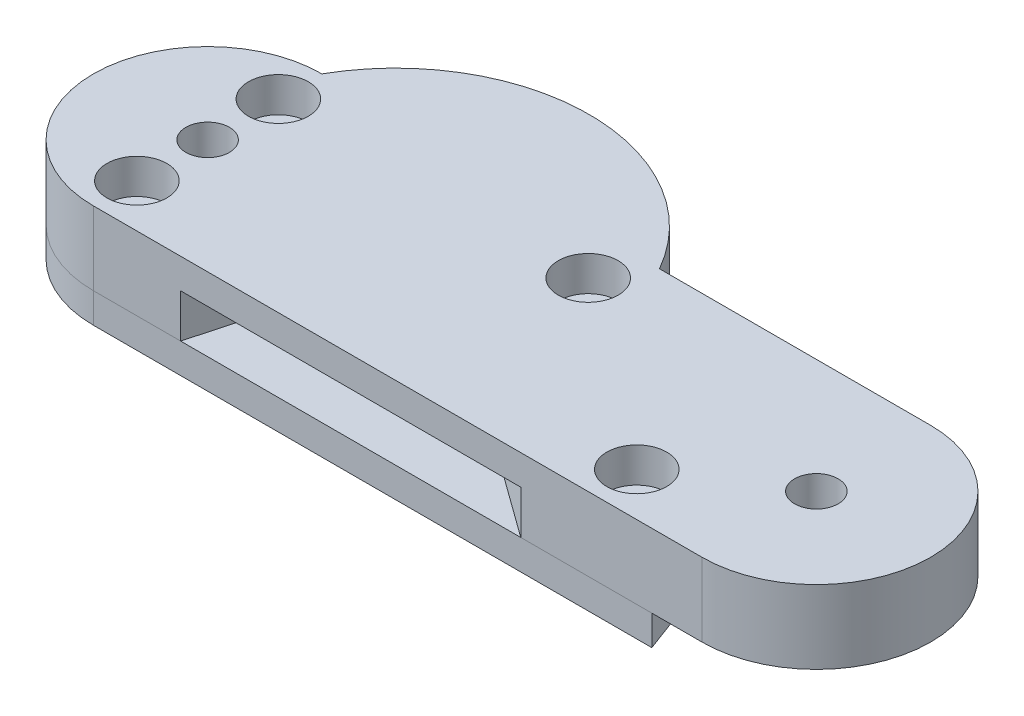
ISO-10303-21;
HEADER;
FILE_DESCRIPTION(('STEP AP214'),'2;1');
FILE_NAME('part.step','',(''),(''),'','','');
FILE_SCHEMA(('AUTOMOTIVE_DESIGN { 1 0 10303 214 1 1 1 1 }'));
ENDSEC;
DATA;
#1=APPLICATION_CONTEXT('core data for automotive mechanical design processes');
#2=APPLICATION_PROTOCOL_DEFINITION('international standard','automotive_design',2000,#1);
#3=PRODUCT_CONTEXT('',#1,'mechanical');
#4=PRODUCT('Part','Part','',(#3));
#5=PRODUCT_RELATED_PRODUCT_CATEGORY('part','',(#4));
#6=PRODUCT_DEFINITION_FORMATION('','',#4);
#7=PRODUCT_DEFINITION_CONTEXT('part definition',#1,'design');
#8=PRODUCT_DEFINITION('design','',#6,#7);
#9=PRODUCT_DEFINITION_SHAPE('','',#8);
#10=(LENGTH_UNIT() NAMED_UNIT(*) SI_UNIT(.MILLI.,.METRE.));
#11=(NAMED_UNIT(*) PLANE_ANGLE_UNIT() SI_UNIT($,.RADIAN.));
#12=(NAMED_UNIT(*) SI_UNIT($,.STERADIAN.) SOLID_ANGLE_UNIT());
#13=UNCERTAINTY_MEASURE_WITH_UNIT(LENGTH_MEASURE(1.E-05),#10,'distance_accuracy_value','');
#14=(GEOMETRIC_REPRESENTATION_CONTEXT(3) GLOBAL_UNCERTAINTY_ASSIGNED_CONTEXT((#13)) GLOBAL_UNIT_ASSIGNED_CONTEXT((#10,
#11,#12)) REPRESENTATION_CONTEXT('',''));
#15=CARTESIAN_POINT('',(0.,0.,0.));
#16=DIRECTION('',(0.,0.,1.));
#17=DIRECTION('',(1.,0.,0.));
#18=AXIS2_PLACEMENT_3D('',#15,#16,#17);
#19=CARTESIAN_POINT('',(0.,2.,0.));
#20=DIRECTION('',(0.,1.,0.));
#21=DIRECTION('',(0.,0.,-1.));
#22=AXIS2_PLACEMENT_3D('',#19,#20,#21);
#23=PLANE('',#22);
#24=CARTESIAN_POINT('',(-40.4241193156667,2.,-1.7460511013579));
#25=DIRECTION('',(0.,1.,0.));
#26=DIRECTION('',(0.,0.,1.));
#27=AXIS2_PLACEMENT_3D('',#24,#25,#26);
#28=CIRCLE('',#27,17.8069548217708);
#29=CARTESIAN_POINT('',(-24.917700351162,2.,-10.5003992165423));
#30=VERTEX_POINT('',#29);
#31=CARTESIAN_POINT('',(-55.9305382801715,2.,-10.5003992165423));
#32=VERTEX_POINT('',#31);
#33=EDGE_CURVE('E123',#30,#32,#28,.T.);
#34=ORIENTED_EDGE('',*,*,#33,.T.);
#35=CARTESIAN_POINT('',(-55.9305382801715,2.,0.));
#36=DIRECTION('',(0.,-1.,0.));
#37=DIRECTION('',(0.,0.,-1.));
#38=AXIS2_PLACEMENT_3D('',#35,#36,#37);
#39=CIRCLE('',#38,10.5003992165423);
#40=CARTESIAN_POINT('',(-55.9305382801715,2.,10.5003992165423));
#41=VERTEX_POINT('',#40);
#42=EDGE_CURVE('E103',#41,#32,#39,.T.);
#43=ORIENTED_EDGE('',*,*,#42,.F.);
#44=DIRECTION('',(1.,0.,0.));
#45=VECTOR('',#44,1.);
#46=CARTESIAN_POINT('',(0.,2.,10.5003992165423));
#47=LINE('',#46,#45);
#48=CARTESIAN_POINT('',(-4.6195471407067,2.,10.5003992165423));
#49=VERTEX_POINT('',#48);
#50=EDGE_CURVE('E112',#41,#49,#47,.T.);
#51=ORIENTED_EDGE('',*,*,#50,.T.);
#52=DIRECTION('',(-0.349715205744596,0.,-0.93685605877905));
#53=VECTOR('',#52,1.);
#54=CARTESIAN_POINT('',(-12.458850175581,2.,-10.5003992165423));
#55=LINE('',#54,#53);
#56=CARTESIAN_POINT('',(-12.458850175581,2.,-10.5003992165423));
#57=VERTEX_POINT('',#56);
#58=EDGE_CURVE('E154',#49,#57,#55,.T.);
#59=ORIENTED_EDGE('',*,*,#58,.T.);
#60=DIRECTION('',(1.,0.,0.));
#61=VECTOR('',#60,1.);
#62=CARTESIAN_POINT('',(0.,2.,-10.5003992165423));
#63=LINE('',#62,#61);
#64=EDGE_CURVE('E124',#30,#57,#63,.T.);
#65=ORIENTED_EDGE('',*,*,#64,.F.);
#66=EDGE_LOOP('',(#34,#43,#51,#59,#65));
#67=FACE_BOUND('',#66,.T.);
#68=CARTESIAN_POINT('',(-55.9305382801715,2.,6.5003992165423));
#69=DIRECTION('',(0.,-1.,0.));
#70=DIRECTION('',(0.,0.,-1.));
#71=AXIS2_PLACEMENT_3D('',#68,#69,#70);
#72=CIRCLE('',#71,1.5);
#73=CARTESIAN_POINT('',(-55.9305382801715,2.,5.0003992165423));
#74=VERTEX_POINT('',#73);
#75=EDGE_CURVE('E171',#74,#74,#72,.F.);
#76=ORIENTED_EDGE('',*,*,#75,.F.);
#77=EDGE_LOOP('',(#76));
#78=FACE_BOUND('',#77,.T.);
#79=CARTESIAN_POINT('',(-55.9305382801715,2.,0.));
#80=DIRECTION('',(0.,-1.,0.));
#81=DIRECTION('',(0.,0.,-1.));
#82=AXIS2_PLACEMENT_3D('',#79,#80,#81);
#83=CIRCLE('',#82,2.);
#84=CARTESIAN_POINT('',(-55.9305382801715,2.,-2.));
#85=VERTEX_POINT('',#84);
#86=EDGE_CURVE('E118',#85,#85,#83,.T.);
#87=ORIENTED_EDGE('',*,*,#86,.T.);
#88=EDGE_LOOP('',(#87));
#89=FACE_BOUND('',#88,.T.);
#90=CARTESIAN_POINT('',(-55.9305382801715,2.,-6.5003992165423));
#91=DIRECTION('',(0.,-1.,0.));
#92=DIRECTION('',(0.,0.,-1.));
#93=AXIS2_PLACEMENT_3D('',#90,#91,#92);
#94=CIRCLE('',#93,1.5);
#95=CARTESIAN_POINT('',(-55.9305382801715,2.,-8.00039921654231));
#96=VERTEX_POINT('',#95);
#97=EDGE_CURVE('E126',#96,#96,#94,.F.);
#98=ORIENTED_EDGE('',*,*,#97,.F.);
#99=EDGE_LOOP('',(#98));
#100=FACE_BOUND('',#99,.T.);
#101=CARTESIAN_POINT('',(-27.4615510728353,2.,-6.5003992165423));
#102=DIRECTION('',(0.,-1.,0.));
#103=DIRECTION('',(0.,0.,-1.));
#104=AXIS2_PLACEMENT_3D('',#101,#102,#103);
#105=CIRCLE('',#104,1.5);
#106=CARTESIAN_POINT('',(-27.4615510728353,2.,-8.00039921654231));
#107=VERTEX_POINT('',#106);
#108=EDGE_CURVE('E165',#107,#107,#105,.F.);
#109=ORIENTED_EDGE('',*,*,#108,.F.);
#110=EDGE_LOOP('',(#109));
#111=FACE_BOUND('',#110,.T.);
#112=CARTESIAN_POINT('',(-10.,2.,6.5003992165423));
#113=DIRECTION('',(0.,-1.,0.));
#114=DIRECTION('',(0.,0.,-1.));
#115=AXIS2_PLACEMENT_3D('',#112,#113,#114);
#116=CIRCLE('',#115,1.5);
#117=CARTESIAN_POINT('',(-10.,2.,5.0003992165423));
#118=VERTEX_POINT('',#117);
#119=EDGE_CURVE('E168',#118,#118,#116,.F.);
#120=ORIENTED_EDGE('',*,*,#119,.F.);
#121=EDGE_LOOP('',(#120));
#122=FACE_BOUND('',#121,.T.);
#123=ADVANCED_FACE('F51',(#67,#78,#89,#100,#111,#122),#23,.T.);
#124=CARTESIAN_POINT('',(0.,-0.75,10.5003992165423));
#125=DIRECTION('',(0.,0.,-1.));
#126=DIRECTION('',(-1.,0.,0.));
#127=AXIS2_PLACEMENT_3D('',#124,#125,#126);
#128=PLANE('',#127);
#129=ORIENTED_EDGE('',*,*,#50,.F.);
#130=DIRECTION('',(0.,1.,0.));
#131=VECTOR('',#130,1.);
#132=CARTESIAN_POINT('',(-55.9305382801715,-0.75,10.5003992165423));
#133=LINE('',#132,#131);
#134=CARTESIAN_POINT('',(-55.9305382801715,-0.75,10.5003992165423));
#135=VERTEX_POINT('',#134);
#136=EDGE_CURVE('E99',#135,#41,#133,.T.);
#137=ORIENTED_EDGE('',*,*,#136,.F.);
#138=DIRECTION('',(1.,0.,0.));
#139=VECTOR('',#138,1.);
#140=CARTESIAN_POINT('',(0.,-0.75,10.5003992165423));
#141=LINE('',#140,#139);
#142=CARTESIAN_POINT('',(-4.6195471407067,-0.75,10.5003992165423));
#143=VERTEX_POINT('',#142);
#144=EDGE_CURVE('E109',#135,#143,#141,.T.);
#145=ORIENTED_EDGE('',*,*,#144,.T.);
#146=DIRECTION('',(0.,-1.,0.));
#147=VECTOR('',#146,1.);
#148=CARTESIAN_POINT('',(-4.6195471407067,33.1152802892206,10.5003992165423));
#149=LINE('',#148,#147);
#150=EDGE_CURVE('E114',#49,#143,#149,.T.);
#151=ORIENTED_EDGE('',*,*,#150,.F.);
#152=EDGE_LOOP('',(#129,#137,#145,#151));
#153=FACE_BOUND('',#152,.T.);
#154=ADVANCED_FACE('F113',(#153),#128,.F.);
#155=CARTESIAN_POINT('',(0.,-0.75,0.));
#156=DIRECTION('',(0.,-1.,0.));
#157=DIRECTION('',(0.,0.,1.));
#158=AXIS2_PLACEMENT_3D('',#155,#156,#157);
#159=PLANE('',#158);
#160=DIRECTION('',(0.349715205744595,0.,0.93685605877905));
#161=VECTOR('',#160,1.);
#162=CARTESIAN_POINT('',(-12.458850175581,-0.75,-10.5003992165423));
#163=LINE('',#162,#161);
#164=CARTESIAN_POINT('',(-12.458850175581,-0.75,-10.5003992165423));
#165=VERTEX_POINT('',#164);
#166=EDGE_CURVE('E12',#165,#143,#163,.T.);
#167=ORIENTED_EDGE('',*,*,#166,.T.);
#168=ORIENTED_EDGE('',*,*,#144,.F.);
#169=CARTESIAN_POINT('',(-55.9305382801715,-0.75,0.));
#170=DIRECTION('',(0.,1.,0.));
#171=DIRECTION('',(0.,0.,1.));
#172=AXIS2_PLACEMENT_3D('',#169,#170,#171);
#173=CIRCLE('',#172,10.5003992165423);
#174=CARTESIAN_POINT('',(-55.9305382801715,-0.749999999999997,-10.5003992165423));
#175=VERTEX_POINT('',#174);
#176=EDGE_CURVE('E106',#175,#135,#173,.T.);
#177=ORIENTED_EDGE('',*,*,#176,.F.);
#178=CARTESIAN_POINT('',(-40.4241193156667,-0.749999999999997,-1.7460511013579));
#179=DIRECTION('',(0.,1.,0.));
#180=DIRECTION('',(0.,0.,1.));
#181=AXIS2_PLACEMENT_3D('',#178,#179,#180);
#182=CIRCLE('',#181,17.8069548217708);
#183=CARTESIAN_POINT('',(-24.917700351162,-0.749999999999997,-10.5003992165423));
#184=VERTEX_POINT('',#183);
#185=EDGE_CURVE('E134',#184,#175,#182,.T.);
#186=ORIENTED_EDGE('',*,*,#185,.F.);
#187=DIRECTION('',(-1.,0.,0.));
#188=VECTOR('',#187,1.);
#189=CARTESIAN_POINT('',(0.,-0.75,-10.5003992165423));
#190=LINE('',#189,#188);
#191=EDGE_CURVE('E139',#165,#184,#190,.T.);
#192=ORIENTED_EDGE('',*,*,#191,.F.);
#193=EDGE_LOOP('',(#167,#168,#177,#186,#192));
#194=FACE_BOUND('',#193,.T.);
#195=CARTESIAN_POINT('',(-55.9305382801715,-0.75,-6.5003992165423));
#196=DIRECTION('',(0.,-1.,0.));
#197=DIRECTION('',(0.,0.,-1.));
#198=AXIS2_PLACEMENT_3D('',#195,#196,#197);
#199=CIRCLE('',#198,1.5);
#200=CARTESIAN_POINT('',(-55.9305382801715,-0.75,-8.00039921654231));
#201=VERTEX_POINT('',#200);
#202=EDGE_CURVE('E151',#201,#201,#199,.T.);
#203=ORIENTED_EDGE('',*,*,#202,.F.);
#204=EDGE_LOOP('',(#203));
#205=FACE_BOUND('',#204,.T.);
#206=CARTESIAN_POINT('',(-55.9305382801715,-0.75,6.5003992165423));
#207=DIRECTION('',(0.,-1.,0.));
#208=DIRECTION('',(0.,0.,-1.));
#209=AXIS2_PLACEMENT_3D('',#206,#207,#208);
#210=CIRCLE('',#209,1.5);
#211=CARTESIAN_POINT('',(-55.9305382801715,-0.75,5.0003992165423));
#212=VERTEX_POINT('',#211);
#213=EDGE_CURVE('E155',#212,#212,#210,.T.);
#214=ORIENTED_EDGE('',*,*,#213,.F.);
#215=EDGE_LOOP('',(#214));
#216=FACE_BOUND('',#215,.T.);
#217=CARTESIAN_POINT('',(-10.,-0.75,6.5003992165423));
#218=DIRECTION('',(0.,-1.,0.));
#219=DIRECTION('',(0.,0.,-1.));
#220=AXIS2_PLACEMENT_3D('',#217,#218,#219);
#221=CIRCLE('',#220,1.5);
#222=CARTESIAN_POINT('',(-10.,-0.75,5.0003992165423));
#223=VERTEX_POINT('',#222);
#224=EDGE_CURVE('E150',#223,#223,#221,.T.);
#225=ORIENTED_EDGE('',*,*,#224,.F.);
#226=EDGE_LOOP('',(#225));
#227=FACE_BOUND('',#226,.T.);
#228=CARTESIAN_POINT('',(-27.4615510728353,-0.75,-6.5003992165423));
#229=DIRECTION('',(0.,-1.,0.));
#230=DIRECTION('',(0.,0.,-1.));
#231=AXIS2_PLACEMENT_3D('',#228,#229,#230);
#232=CIRCLE('',#231,1.5);
#233=CARTESIAN_POINT('',(-27.4615510728353,-0.75,-8.00039921654231));
#234=VERTEX_POINT('',#233);
#235=EDGE_CURVE('E147',#234,#234,#232,.T.);
#236=ORIENTED_EDGE('',*,*,#235,.F.);
#237=EDGE_LOOP('',(#236));
#238=FACE_BOUND('',#237,.T.);
#239=CARTESIAN_POINT('',(-55.9305382801715,-0.75,0.));
#240=DIRECTION('',(0.,1.,0.));
#241=DIRECTION('',(0.,0.,1.));
#242=AXIS2_PLACEMENT_3D('',#239,#240,#241);
#243=CIRCLE('',#242,2.);
#244=CARTESIAN_POINT('',(-55.9305382801715,-0.75,2.));
#245=VERTEX_POINT('',#244);
#246=EDGE_CURVE('E135',#245,#245,#243,.T.);
#247=ORIENTED_EDGE('',*,*,#246,.T.);
#248=EDGE_LOOP('',(#247));
#249=FACE_BOUND('',#248,.T.);
#250=ADVANCED_FACE('F137',(#194,#205,#216,#227,#238,#249),#159,.T.);
#251=CARTESIAN_POINT('',(0.,-0.75,-10.5003992165423));
#252=DIRECTION('',(0.,0.,1.));
#253=DIRECTION('',(1.,0.,0.));
#254=AXIS2_PLACEMENT_3D('',#251,#252,#253);
#255=PLANE('',#254);
#256=ORIENTED_EDGE('',*,*,#64,.T.);
#257=DIRECTION('',(0.,-1.,0.));
#258=VECTOR('',#257,1.);
#259=CARTESIAN_POINT('',(-12.458850175581,33.1152802892206,-10.5003992165423));
#260=LINE('',#259,#258);
#261=EDGE_CURVE('E60',#57,#165,#260,.T.);
#262=ORIENTED_EDGE('',*,*,#261,.T.);
#263=ORIENTED_EDGE('',*,*,#191,.T.);
#264=DIRECTION('',(0.,1.,0.));
#265=VECTOR('',#264,1.);
#266=CARTESIAN_POINT('',(-24.917700351162,-33.0570550282,-10.5003992165423));
#267=LINE('',#266,#265);
#268=EDGE_CURVE('E55',#184,#30,#267,.T.);
#269=ORIENTED_EDGE('',*,*,#268,.T.);
#270=EDGE_LOOP('',(#256,#262,#263,#269));
#271=FACE_BOUND('',#270,.T.);
#272=ADVANCED_FACE('F206',(#271),#255,.F.);
#273=CARTESIAN_POINT('',(-12.458850175581,33.1152802892206,-10.5003992165423));
#274=DIRECTION('',(-0.93685605877905,0.,0.349715205744596));
#275=DIRECTION('',(0.349715205744596,0.,0.93685605877905));
#276=AXIS2_PLACEMENT_3D('',#273,#274,#275);
#277=PLANE('',#276);
#278=ORIENTED_EDGE('',*,*,#58,.F.);
#279=ORIENTED_EDGE('',*,*,#150,.T.);
#280=ORIENTED_EDGE('',*,*,#166,.F.);
#281=ORIENTED_EDGE('',*,*,#261,.F.);
#282=EDGE_LOOP('',(#278,#279,#280,#281));
#283=FACE_BOUND('',#282,.T.);
#284=ADVANCED_FACE('F209',(#283),#277,.F.);
#285=CARTESIAN_POINT('',(-55.9305382801715,-0.75,0.));
#286=DIRECTION('',(0.,1.,0.));
#287=DIRECTION('',(0.,0.,-1.));
#288=AXIS2_PLACEMENT_3D('',#285,#286,#287);
#289=CYLINDRICAL_SURFACE('',#288,10.5003992165423);
#290=ORIENTED_EDGE('',*,*,#42,.T.);
#291=DIRECTION('',(0.,1.,0.));
#292=VECTOR('',#291,1.);
#293=CARTESIAN_POINT('',(-55.9305382801715,-0.75,-10.5003992165423));
#294=LINE('',#293,#292);
#295=EDGE_CURVE('E110',#175,#32,#294,.T.);
#296=ORIENTED_EDGE('',*,*,#295,.F.);
#297=ORIENTED_EDGE('',*,*,#176,.T.);
#298=ORIENTED_EDGE('',*,*,#136,.T.);
#299=EDGE_LOOP('',(#290,#296,#297,#298));
#300=FACE_BOUND('',#299,.T.);
#301=ADVANCED_FACE('F101',(#300),#289,.T.);
#302=CARTESIAN_POINT('',(-40.4241193156667,-33.0570550282,-1.7460511013579));
#303=DIRECTION('',(0.,1.,0.));
#304=DIRECTION('',(0.,0.,-1.));
#305=AXIS2_PLACEMENT_3D('',#302,#303,#304);
#306=CYLINDRICAL_SURFACE('',#305,17.8069548217708);
#307=ORIENTED_EDGE('',*,*,#268,.F.);
#308=ORIENTED_EDGE('',*,*,#185,.T.);
#309=ORIENTED_EDGE('',*,*,#295,.T.);
#310=ORIENTED_EDGE('',*,*,#33,.F.);
#311=EDGE_LOOP('',(#307,#308,#309,#310));
#312=FACE_BOUND('',#311,.T.);
#313=ADVANCED_FACE('F132',(#312),#306,.T.);
#314=CARTESIAN_POINT('',(-55.9305382801715,-0.75,0.));
#315=DIRECTION('',(0.,1.,0.));
#316=DIRECTION('',(0.,0.,-1.));
#317=AXIS2_PLACEMENT_3D('',#314,#315,#316);
#318=CYLINDRICAL_SURFACE('',#317,2.);
#319=ORIENTED_EDGE('',*,*,#246,.F.);
#320=EDGE_LOOP('',(#319));
#321=FACE_BOUND('',#320,.T.);
#322=ORIENTED_EDGE('',*,*,#86,.F.);
#323=EDGE_LOOP('',(#322));
#324=FACE_BOUND('',#323,.T.);
#325=ADVANCED_FACE('F199',(#321,#324),#318,.F.);
#326=CARTESIAN_POINT('',(-55.9305382801715,-0.75,-6.5003992165423));
#327=DIRECTION('',(0.,1.,0.));
#328=DIRECTION('',(0.,0.,-1.));
#329=AXIS2_PLACEMENT_3D('',#326,#327,#328);
#330=CYLINDRICAL_SURFACE('',#329,1.5);
#331=ORIENTED_EDGE('',*,*,#202,.T.);
#332=EDGE_LOOP('',(#331));
#333=FACE_BOUND('',#332,.T.);
#334=ORIENTED_EDGE('',*,*,#97,.T.);
#335=EDGE_LOOP('',(#334));
#336=FACE_BOUND('',#335,.T.);
#337=ADVANCED_FACE('F176',(#333,#336),#330,.F.);
#338=CARTESIAN_POINT('',(-55.9305382801715,-0.75,6.5003992165423));
#339=DIRECTION('',(0.,1.,0.));
#340=DIRECTION('',(0.,0.,-1.));
#341=AXIS2_PLACEMENT_3D('',#338,#339,#340);
#342=CYLINDRICAL_SURFACE('',#341,1.5);
#343=ORIENTED_EDGE('',*,*,#213,.T.);
#344=EDGE_LOOP('',(#343));
#345=FACE_BOUND('',#344,.T.);
#346=ORIENTED_EDGE('',*,*,#75,.T.);
#347=EDGE_LOOP('',(#346));
#348=FACE_BOUND('',#347,.T.);
#349=ADVANCED_FACE('F187',(#345,#348),#342,.F.);
#350=CARTESIAN_POINT('',(-10.,-0.75,6.5003992165423));
#351=DIRECTION('',(0.,1.,0.));
#352=DIRECTION('',(0.,0.,-1.));
#353=AXIS2_PLACEMENT_3D('',#350,#351,#352);
#354=CYLINDRICAL_SURFACE('',#353,1.5);
#355=ORIENTED_EDGE('',*,*,#224,.T.);
#356=EDGE_LOOP('',(#355));
#357=FACE_BOUND('',#356,.T.);
#358=ORIENTED_EDGE('',*,*,#119,.T.);
#359=EDGE_LOOP('',(#358));
#360=FACE_BOUND('',#359,.T.);
#361=ADVANCED_FACE('F185',(#357,#360),#354,.F.);
#362=CARTESIAN_POINT('',(-27.4615510728353,-0.75,-6.5003992165423));
#363=DIRECTION('',(0.,1.,0.));
#364=DIRECTION('',(0.,0.,-1.));
#365=AXIS2_PLACEMENT_3D('',#362,#363,#364);
#366=CYLINDRICAL_SURFACE('',#365,1.5);
#367=ORIENTED_EDGE('',*,*,#235,.T.);
#368=EDGE_LOOP('',(#367));
#369=FACE_BOUND('',#368,.T.);
#370=ORIENTED_EDGE('',*,*,#108,.T.);
#371=EDGE_LOOP('',(#370));
#372=FACE_BOUND('',#371,.T.);
#373=ADVANCED_FACE('F53',(#369,#372),#366,.F.);
#374=CLOSED_SHELL('',(#123,#154,#250,#272,#284,#301,#313,#325,#337,#349,#361,#373));
#375=MANIFOLD_SOLID_BREP('B2',#374);
#376=CARTESIAN_POINT('',(0.,2.,0.));
#377=DIRECTION('',(0.,1.,0.));
#378=DIRECTION('',(0.,0.,-1.));
#379=AXIS2_PLACEMENT_3D('',#376,#377,#378);
#380=PLANE('',#379);
#381=CARTESIAN_POINT('',(-55.9305382801715,2.,-6.5003992165423));
#382=DIRECTION('',(0.,-1.,0.));
#383=DIRECTION('',(0.,0.,-1.));
#384=AXIS2_PLACEMENT_3D('',#381,#382,#383);
#385=CIRCLE('',#384,1.5);
#386=CARTESIAN_POINT('',(-55.9305382801715,2.,-8.00039921654231));
#387=VERTEX_POINT('',#386);
#388=EDGE_CURVE('E537',#387,#387,#385,.F.);
#389=ORIENTED_EDGE('',*,*,#388,.T.);
#390=EDGE_LOOP('',(#389));
#391=FACE_BOUND('',#390,.T.);
#392=CARTESIAN_POINT('',(-55.9305382801715,2.,0.));
#393=DIRECTION('',(0.,-1.,0.));
#394=DIRECTION('',(0.,0.,-1.));
#395=AXIS2_PLACEMENT_3D('',#392,#393,#394);
#396=CIRCLE('',#395,2.);
#397=CARTESIAN_POINT('',(-55.9305382801715,2.,-2.));
#398=VERTEX_POINT('',#397);
#399=EDGE_CURVE('E49',#398,#398,#396,.T.);
#400=ORIENTED_EDGE('',*,*,#399,.F.);
#401=EDGE_LOOP('',(#400));
#402=FACE_BOUND('',#401,.T.);
#403=CARTESIAN_POINT('',(-55.9305382801715,2.,0.));
#404=DIRECTION('',(0.,-1.,0.));
#405=DIRECTION('',(0.,0.,-1.));
#406=AXIS2_PLACEMENT_3D('',#403,#404,#405);
#407=CIRCLE('',#406,10.5003992165423);
#408=CARTESIAN_POINT('',(-55.9305382801715,2.,10.5003992165423));
#409=VERTEX_POINT('',#408);
#410=CARTESIAN_POINT('',(-55.9305382801715,2.,-10.5003992165423));
#411=VERTEX_POINT('',#410);
#412=EDGE_CURVE('E521',#409,#411,#407,.T.);
#413=ORIENTED_EDGE('',*,*,#412,.T.);
#414=CARTESIAN_POINT('',(-40.4241193156667,2.,-1.7460511013579));
#415=DIRECTION('',(0.,-1.,0.));
#416=DIRECTION('',(0.,0.,-1.));
#417=AXIS2_PLACEMENT_3D('',#414,#415,#416);
#418=CIRCLE('',#417,17.8069548217708);
#419=CARTESIAN_POINT('',(-54.8543825263999,2.,-12.1794179449777));
#420=VERTEX_POINT('',#419);
#421=EDGE_CURVE('E535',#411,#420,#418,.T.);
#422=ORIENTED_EDGE('',*,*,#421,.T.);
#423=DIRECTION('',(0.810372315489383,0.,0.585915275691269));
#424=VECTOR('',#423,1.);
#425=CARTESIAN_POINT('',(-43.8872651072943,2.,-4.24997427651618));
#426=LINE('',#425,#424);
#427=CARTESIAN_POINT('',(-43.8872651072943,2.,-4.24997427651618));
#428=VERTEX_POINT('',#427);
#429=EDGE_CURVE('E487',#420,#428,#426,.T.);
#430=ORIENTED_EDGE('',*,*,#429,.T.);
#431=DIRECTION('',(-0.263153614525289,0.,0.964753945398657));
#432=VECTOR('',#431,1.);
#433=CARTESIAN_POINT('',(-43.8872651072943,2.,-4.24997427651618));
#434=LINE('',#433,#432);
#435=CARTESIAN_POINT('',(-47.9106890267398,2.,10.5003992165423));
#436=VERTEX_POINT('',#435);
#437=EDGE_CURVE('E474',#428,#436,#434,.T.);
#438=ORIENTED_EDGE('',*,*,#437,.T.);
#439=DIRECTION('',(-1.,0.,0.));
#440=VECTOR('',#439,1.);
#441=CARTESIAN_POINT('',(0.,2.,10.5003992165423));
#442=LINE('',#441,#440);
#443=EDGE_CURVE('E532',#436,#409,#442,.T.);
#444=ORIENTED_EDGE('',*,*,#443,.T.);
#445=EDGE_LOOP('',(#413,#422,#430,#438,#444));
#446=FACE_BOUND('',#445,.T.);
#447=CARTESIAN_POINT('',(-55.9305382801715,2.,6.5003992165423));
#448=DIRECTION('',(0.,-1.,0.));
#449=DIRECTION('',(0.,0.,-1.));
#450=AXIS2_PLACEMENT_3D('',#447,#448,#449);
#451=CIRCLE('',#450,1.5);
#452=CARTESIAN_POINT('',(-55.9305382801715,2.,5.0003992165423));
#453=VERTEX_POINT('',#452);
#454=EDGE_CURVE('E542',#453,#453,#451,.F.);
#455=ORIENTED_EDGE('',*,*,#454,.T.);
#456=EDGE_LOOP('',(#455));
#457=FACE_BOUND('',#456,.T.);
#458=ADVANCED_FACE('F318',(#391,#402,#446,#457),#380,.F.);
#459=CARTESIAN_POINT('',(-41.5933955268113,2.,-5.05946240908561));
#460=DIRECTION('',(0.,-1.,0.));
#461=DIRECTION('',(0.,0.,1.));
#462=AXIS2_PLACEMENT_3D('',#459,#460,#461);
#463=PLANE('',#462);
#464=CARTESIAN_POINT('',(0.,2.,0.));
#465=DIRECTION('',(0.,1.,0.));
#466=DIRECTION('',(0.,0.,1.));
#467=AXIS2_PLACEMENT_3D('',#464,#465,#466);
#468=CIRCLE('',#467,2.);
#469=CARTESIAN_POINT('',(0.,2.,2.));
#470=VERTEX_POINT('',#469);
#471=EDGE_CURVE('E428',#470,#470,#468,.T.);
#472=ORIENTED_EDGE('',*,*,#471,.T.);
#473=EDGE_LOOP('',(#472));
#474=FACE_BOUND('',#473,.T.);
#475=DIRECTION('',(1.,0.,0.));
#476=VECTOR('',#475,1.);
#477=CARTESIAN_POINT('',(-12.458850175581,2.,-10.5003992165423));
#478=LINE('',#477,#476);
#479=CARTESIAN_POINT('',(-24.917700351162,2.,-10.5003992165423));
#480=VERTEX_POINT('',#479);
#481=CARTESIAN_POINT('',(0.,2.,-10.5003992165423));
#482=VERTEX_POINT('',#481);
#483=EDGE_CURVE('E409',#480,#482,#478,.T.);
#484=ORIENTED_EDGE('',*,*,#483,.T.);
#485=CARTESIAN_POINT('',(0.,2.,0.));
#486=DIRECTION('',(0.,1.,0.));
#487=DIRECTION('',(0.,0.,1.));
#488=AXIS2_PLACEMENT_3D('',#485,#486,#487);
#489=CIRCLE('',#488,10.5003992165423);
#490=CARTESIAN_POINT('',(0.,2.,10.5003992165423));
#491=VERTEX_POINT('',#490);
#492=EDGE_CURVE('E416',#482,#491,#489,.F.);
#493=ORIENTED_EDGE('',*,*,#492,.T.);
#494=DIRECTION('',(-1.,0.,0.));
#495=VECTOR('',#494,1.);
#496=CARTESIAN_POINT('',(-4.6195471407067,2.,10.5003992165423));
#497=LINE('',#496,#495);
#498=CARTESIAN_POINT('',(-16.659276720951,2.,10.5003992165423));
#499=VERTEX_POINT('',#498);
#500=EDGE_CURVE('E422',#491,#499,#497,.T.);
#501=ORIENTED_EDGE('',*,*,#500,.T.);
#502=DIRECTION('',(-0.810372315489383,0.,-0.585915275691269));
#503=VECTOR('',#502,1.);
#504=CARTESIAN_POINT('',(26.6452391554762,2.,41.8104240945407));
#505=LINE('',#504,#503);
#506=CARTESIAN_POINT('',(-39.2995259463282,2.,-5.86895054165502));
#507=VERTEX_POINT('',#506);
#508=EDGE_CURVE('E470',#499,#507,#505,.T.);
#509=ORIENTED_EDGE('',*,*,#508,.T.);
#510=DIRECTION('',(0.263153614525288,0.,-0.964753945398658));
#511=VECTOR('',#510,1.);
#512=CARTESIAN_POINT('',(-35.7518279113757,2.,-18.8752536565782));
#513=LINE('',#512,#511);
#514=CARTESIAN_POINT('',(-35.7381547906292,2.,-18.9253810211969));
#515=VERTEX_POINT('',#514);
#516=EDGE_CURVE('E485',#507,#515,#513,.T.);
#517=ORIENTED_EDGE('',*,*,#516,.T.);
#518=EDGE_CURVE('E427',#515,#480,#418,.T.);
#519=ORIENTED_EDGE('',*,*,#518,.T.);
#520=EDGE_LOOP('',(#484,#493,#501,#509,#517,#519));
#521=FACE_BOUND('',#520,.T.);
#522=CARTESIAN_POINT('',(-10.,2.,6.5003992165423));
#523=DIRECTION('',(0.,-1.,0.));
#524=DIRECTION('',(0.,0.,-1.));
#525=AXIS2_PLACEMENT_3D('',#522,#523,#524);
#526=CIRCLE('',#525,1.5);
#527=CARTESIAN_POINT('',(-10.,2.,5.0003992165423));
#528=VERTEX_POINT('',#527);
#529=EDGE_CURVE('E544',#528,#528,#526,.F.);
#530=ORIENTED_EDGE('',*,*,#529,.T.);
#531=EDGE_LOOP('',(#530));
#532=FACE_BOUND('',#531,.T.);
#533=CARTESIAN_POINT('',(-27.4615510728353,2.,-6.5003992165423));
#534=DIRECTION('',(0.,-1.,0.));
#535=DIRECTION('',(0.,0.,-1.));
#536=AXIS2_PLACEMENT_3D('',#533,#534,#535);
#537=CIRCLE('',#536,1.5);
#538=CARTESIAN_POINT('',(-27.4615510728353,2.,-8.00039921654231));
#539=VERTEX_POINT('',#538);
#540=EDGE_CURVE('E321',#539,#539,#537,.F.);
#541=ORIENTED_EDGE('',*,*,#540,.T.);
#542=EDGE_LOOP('',(#541));
#543=FACE_BOUND('',#542,.T.);
#544=ADVANCED_FACE('F424',(#474,#521,#532,#543),#463,.T.);
#545=CARTESIAN_POINT('',(-55.9305382801715,5.55,6.5003992165423));
#546=DIRECTION('',(0.,1.,0.));
#547=DIRECTION('',(0.,0.,-1.));
#548=AXIS2_PLACEMENT_3D('',#545,#546,#547);
#549=CYLINDRICAL_SURFACE('',#548,2.75);
#550=CARTESIAN_POINT('',(-55.9305382801715,5.55,6.5003992165423));
#551=DIRECTION('',(0.,-1.,0.));
#552=DIRECTION('',(0.,0.,-1.));
#553=AXIS2_PLACEMENT_3D('',#550,#551,#552);
#554=CIRCLE('',#553,2.75);
#555=CARTESIAN_POINT('',(-55.9305382801715,5.55,3.7503992165423));
#556=VERTEX_POINT('',#555);
#557=EDGE_CURVE('E453',#556,#556,#554,.T.);
#558=ORIENTED_EDGE('',*,*,#557,.T.);
#559=EDGE_LOOP('',(#558));
#560=FACE_BOUND('',#559,.T.);
#561=CARTESIAN_POINT('',(-55.9305382801715,8.75,6.5003992165423));
#562=DIRECTION('',(0.,-1.,0.));
#563=DIRECTION('',(0.,0.,-1.));
#564=AXIS2_PLACEMENT_3D('',#561,#562,#563);
#565=CIRCLE('',#564,2.75);
#566=CARTESIAN_POINT('',(-55.9305382801715,8.75,3.7503992165423));
#567=VERTEX_POINT('',#566);
#568=EDGE_CURVE('E438',#567,#567,#565,.T.);
#569=ORIENTED_EDGE('',*,*,#568,.F.);
#570=EDGE_LOOP('',(#569));
#571=FACE_BOUND('',#570,.T.);
#572=ADVANCED_FACE('F576',(#560,#571),#549,.F.);
#573=CARTESIAN_POINT('',(-55.9305382801715,5.55,-6.5003992165423));
#574=DIRECTION('',(0.,1.,0.));
#575=DIRECTION('',(0.,0.,-1.));
#576=AXIS2_PLACEMENT_3D('',#573,#574,#575);
#577=CYLINDRICAL_SURFACE('',#576,2.75);
#578=CARTESIAN_POINT('',(-55.9305382801715,5.55,-6.5003992165423));
#579=DIRECTION('',(0.,-1.,0.));
#580=DIRECTION('',(0.,0.,-1.));
#581=AXIS2_PLACEMENT_3D('',#578,#579,#580);
#582=CIRCLE('',#581,2.75);
#583=CARTESIAN_POINT('',(-55.9305382801715,5.55,-9.2503992165423));
#584=VERTEX_POINT('',#583);
#585=EDGE_CURVE('E435',#584,#584,#582,.T.);
#586=ORIENTED_EDGE('',*,*,#585,.T.);
#587=EDGE_LOOP('',(#586));
#588=FACE_BOUND('',#587,.T.);
#589=CARTESIAN_POINT('',(-55.9305382801715,8.75,-6.5003992165423));
#590=DIRECTION('',(0.,-1.,0.));
#591=DIRECTION('',(0.,0.,-1.));
#592=AXIS2_PLACEMENT_3D('',#589,#590,#591);
#593=CIRCLE('',#592,2.75);
#594=CARTESIAN_POINT('',(-55.9305382801715,8.75,-9.2503992165423));
#595=VERTEX_POINT('',#594);
#596=EDGE_CURVE('E439',#595,#595,#593,.T.);
#597=ORIENTED_EDGE('',*,*,#596,.F.);
#598=EDGE_LOOP('',(#597));
#599=FACE_BOUND('',#598,.T.);
#600=ADVANCED_FACE('F610',(#588,#599),#577,.F.);
#601=CARTESIAN_POINT('',(-27.4615510728353,5.55,-6.5003992165423));
#602=DIRECTION('',(0.,1.,0.));
#603=DIRECTION('',(0.,0.,-1.));
#604=AXIS2_PLACEMENT_3D('',#601,#602,#603);
#605=CYLINDRICAL_SURFACE('',#604,2.75);
#606=CARTESIAN_POINT('',(-27.4615510728353,5.55,-6.5003992165423));
#607=DIRECTION('',(0.,-1.,0.));
#608=DIRECTION('',(0.,0.,-1.));
#609=AXIS2_PLACEMENT_3D('',#606,#607,#608);
#610=CIRCLE('',#609,2.75);
#611=CARTESIAN_POINT('',(-27.4615510728353,5.55,-9.2503992165423));
#612=VERTEX_POINT('',#611);
#613=EDGE_CURVE('E442',#612,#612,#610,.T.);
#614=ORIENTED_EDGE('',*,*,#613,.T.);
#615=EDGE_LOOP('',(#614));
#616=FACE_BOUND('',#615,.T.);
#617=CARTESIAN_POINT('',(-27.4615510728353,8.75,-6.5003992165423));
#618=DIRECTION('',(0.,-1.,0.));
#619=DIRECTION('',(0.,0.,-1.));
#620=AXIS2_PLACEMENT_3D('',#617,#618,#619);
#621=CIRCLE('',#620,2.75);
#622=CARTESIAN_POINT('',(-27.4615510728353,8.75,-9.2503992165423));
#623=VERTEX_POINT('',#622);
#624=EDGE_CURVE('E445',#623,#623,#621,.T.);
#625=ORIENTED_EDGE('',*,*,#624,.F.);
#626=EDGE_LOOP('',(#625));
#627=FACE_BOUND('',#626,.T.);
#628=ADVANCED_FACE('F724',(#616,#627),#605,.F.);
#629=CARTESIAN_POINT('',(-10.,5.55,6.5003992165423));
#630=DIRECTION('',(0.,1.,0.));
#631=DIRECTION('',(0.,0.,-1.));
#632=AXIS2_PLACEMENT_3D('',#629,#630,#631);
#633=CYLINDRICAL_SURFACE('',#632,2.75);
#634=CARTESIAN_POINT('',(-10.,5.55,6.5003992165423));
#635=DIRECTION('',(0.,-1.,0.));
#636=DIRECTION('',(0.,0.,-1.));
#637=AXIS2_PLACEMENT_3D('',#634,#635,#636);
#638=CIRCLE('',#637,2.75);
#639=CARTESIAN_POINT('',(-10.,5.55,3.7503992165423));
#640=VERTEX_POINT('',#639);
#641=EDGE_CURVE('E448',#640,#640,#638,.T.);
#642=ORIENTED_EDGE('',*,*,#641,.T.);
#643=EDGE_LOOP('',(#642));
#644=FACE_BOUND('',#643,.T.);
#645=CARTESIAN_POINT('',(-10.,8.75,6.5003992165423));
#646=DIRECTION('',(0.,-1.,0.));
#647=DIRECTION('',(0.,0.,-1.));
#648=AXIS2_PLACEMENT_3D('',#645,#646,#647);
#649=CIRCLE('',#648,2.75);
#650=CARTESIAN_POINT('',(-10.,8.75,3.7503992165423));
#651=VERTEX_POINT('',#650);
#652=EDGE_CURVE('E431',#651,#651,#649,.T.);
#653=ORIENTED_EDGE('',*,*,#652,.F.);
#654=EDGE_LOOP('',(#653));
#655=FACE_BOUND('',#654,.T.);
#656=ADVANCED_FACE('F607',(#644,#655),#633,.F.);
#657=CARTESIAN_POINT('',(-35.7518279113757,6.,-18.8752536565782));
#658=DIRECTION('',(0.964753945398658,0.,0.263153614525288));
#659=DIRECTION('',(0.263153614525288,0.,-0.964753945398658));
#660=AXIS2_PLACEMENT_3D('',#657,#658,#659);
#661=PLANE('',#660);
#662=DIRECTION('',(0.263153614525288,0.,-0.964753945398658));
#663=VECTOR('',#662,1.);
#664=CARTESIAN_POINT('',(-35.7518279113757,6.,-18.8752536565782));
#665=LINE('',#664,#663);
#666=CARTESIAN_POINT('',(-39.2995259463282,6.,-5.86895054165502));
#667=VERTEX_POINT('',#666);
#668=CARTESIAN_POINT('',(-35.7381547906292,6.,-18.9253810211969));
#669=VERTEX_POINT('',#668);
#670=EDGE_CURVE('E473',#667,#669,#665,.T.);
#671=ORIENTED_EDGE('',*,*,#670,.T.);
#672=DIRECTION('',(0.,-1.,0.));
#673=VECTOR('',#672,1.);
#674=CARTESIAN_POINT('',(-35.7381547906292,6.,-18.9253810211969));
#675=LINE('',#674,#673);
#676=EDGE_CURVE('E462',#669,#515,#675,.T.);
#677=ORIENTED_EDGE('',*,*,#676,.T.);
#678=ORIENTED_EDGE('',*,*,#516,.F.);
#679=DIRECTION('',(0.,-1.,0.));
#680=VECTOR('',#679,1.);
#681=CARTESIAN_POINT('',(-39.2995259463282,6.,-5.86895054165502));
#682=LINE('',#681,#680);
#683=EDGE_CURVE('E482',#667,#507,#682,.T.);
#684=ORIENTED_EDGE('',*,*,#683,.F.);
#685=EDGE_LOOP('',(#671,#677,#678,#684));
#686=FACE_BOUND('',#685,.T.);
#687=ADVANCED_FACE('F617',(#686),#661,.F.);
#688=CARTESIAN_POINT('',(-40.4241193156667,-33.0570550282,-1.7460511013579));
#689=DIRECTION('',(0.,1.,0.));
#690=DIRECTION('',(0.,0.,-1.));
#691=AXIS2_PLACEMENT_3D('',#688,#689,#690);
#692=CYLINDRICAL_SURFACE('',#691,17.8069548217708);
#693=ORIENTED_EDGE('',*,*,#676,.F.);
#694=CARTESIAN_POINT('',(-40.4241193156667,6.,-1.7460511013579));
#695=DIRECTION('',(0.,1.,0.));
#696=DIRECTION('',(0.,0.,1.));
#697=AXIS2_PLACEMENT_3D('',#694,#695,#696);
#698=CIRCLE('',#697,17.8069548217708);
#699=CARTESIAN_POINT('',(-54.8543825263999,6.,-12.1794179449777));
#700=VERTEX_POINT('',#699);
#701=EDGE_CURVE('E459',#669,#700,#698,.T.);
#702=ORIENTED_EDGE('',*,*,#701,.T.);
#703=DIRECTION('',(0.,-1.,0.));
#704=VECTOR('',#703,1.);
#705=CARTESIAN_POINT('',(-54.8543825263999,6.,-12.1794179449777));
#706=LINE('',#705,#704);
#707=EDGE_CURVE('E464',#700,#420,#706,.T.);
#708=ORIENTED_EDGE('',*,*,#707,.T.);
#709=ORIENTED_EDGE('',*,*,#421,.F.);
#710=DIRECTION('',(0.,1.,0.));
#711=VECTOR('',#710,1.);
#712=CARTESIAN_POINT('',(-55.9305382801715,-0.75,-10.5003992165423));
#713=LINE('',#712,#711);
#714=CARTESIAN_POINT('',(-55.9305382801715,8.75,-10.5003992165423));
#715=VERTEX_POINT('',#714);
#716=EDGE_CURVE('E341',#411,#715,#713,.T.);
#717=ORIENTED_EDGE('',*,*,#716,.T.);
#718=CARTESIAN_POINT('',(-40.4241193156667,8.75,-1.7460511013579));
#719=DIRECTION('',(0.,1.,0.));
#720=DIRECTION('',(0.,0.,1.));
#721=AXIS2_PLACEMENT_3D('',#718,#719,#720);
#722=CIRCLE('',#721,17.8069548217708);
#723=CARTESIAN_POINT('',(-24.917700351162,8.75,-10.5003992165423));
#724=VERTEX_POINT('',#723);
#725=EDGE_CURVE('E466',#715,#724,#722,.F.);
#726=ORIENTED_EDGE('',*,*,#725,.T.);
#727=DIRECTION('',(0.,1.,0.));
#728=VECTOR('',#727,1.);
#729=CARTESIAN_POINT('',(-24.917700351162,-33.0570550282,-10.5003992165423));
#730=LINE('',#729,#728);
#731=EDGE_CURVE('E333',#480,#724,#730,.T.);
#732=ORIENTED_EDGE('',*,*,#731,.F.);
#733=ORIENTED_EDGE('',*,*,#518,.F.);
#734=EDGE_LOOP('',(#693,#702,#708,#709,#717,#726,#732,#733));
#735=FACE_BOUND('',#734,.T.);
#736=ADVANCED_FACE('F613',(#735),#692,.T.);
#737=CARTESIAN_POINT('',(-55.9305382801715,-0.75,0.));
#738=DIRECTION('',(0.,1.,0.));
#739=DIRECTION('',(0.,0.,-1.));
#740=AXIS2_PLACEMENT_3D('',#737,#738,#739);
#741=CYLINDRICAL_SURFACE('',#740,10.5003992165423);
#742=DIRECTION('',(0.,1.,0.));
#743=VECTOR('',#742,1.);
#744=CARTESIAN_POINT('',(-55.9305382801715,-0.75,10.5003992165423));
#745=LINE('',#744,#743);
#746=CARTESIAN_POINT('',(-55.9305382801715,8.75,10.5003992165423));
#747=VERTEX_POINT('',#746);
#748=EDGE_CURVE('E511',#409,#747,#745,.T.);
#749=ORIENTED_EDGE('',*,*,#748,.T.);
#750=CARTESIAN_POINT('',(-55.9305382801715,8.75,0.));
#751=DIRECTION('',(0.,1.,0.));
#752=DIRECTION('',(0.,0.,1.));
#753=AXIS2_PLACEMENT_3D('',#750,#751,#752);
#754=CIRCLE('',#753,10.5003992165423);
#755=EDGE_CURVE('E504',#715,#747,#754,.T.);
#756=ORIENTED_EDGE('',*,*,#755,.F.);
#757=ORIENTED_EDGE('',*,*,#716,.F.);
#758=ORIENTED_EDGE('',*,*,#412,.F.);
#759=EDGE_LOOP('',(#749,#756,#757,#758));
#760=FACE_BOUND('',#759,.T.);
#761=ADVANCED_FACE('F616',(#760),#741,.T.);
#762=CARTESIAN_POINT('',(-43.8872651072943,6.,-4.24997427651618));
#763=DIRECTION('',(-0.964753945398657,0.,-0.263153614525289));
#764=DIRECTION('',(-0.263153614525289,0.,0.964753945398657));
#765=AXIS2_PLACEMENT_3D('',#762,#763,#764);
#766=PLANE('',#765);
#767=DIRECTION('',(-0.263153614525289,0.,0.964753945398657));
#768=VECTOR('',#767,1.);
#769=CARTESIAN_POINT('',(-43.8872651072943,6.,-4.24997427651618));
#770=LINE('',#769,#768);
#771=CARTESIAN_POINT('',(-43.8872651072943,6.,-4.24997427651618));
#772=VERTEX_POINT('',#771);
#773=CARTESIAN_POINT('',(-47.9106890267398,6.,10.5003992165423));
#774=VERTEX_POINT('',#773);
#775=EDGE_CURVE('E479',#772,#774,#770,.T.);
#776=ORIENTED_EDGE('',*,*,#775,.T.);
#777=DIRECTION('',(0.,-1.,0.));
#778=VECTOR('',#777,1.);
#779=CARTESIAN_POINT('',(-47.9106890267398,-0.75,10.5003992165423));
#780=LINE('',#779,#778);
#781=EDGE_CURVE('E413',#774,#436,#780,.T.);
#782=ORIENTED_EDGE('',*,*,#781,.T.);
#783=ORIENTED_EDGE('',*,*,#437,.F.);
#784=DIRECTION('',(0.,-1.,0.));
#785=VECTOR('',#784,1.);
#786=CARTESIAN_POINT('',(-43.8872651072943,6.,-4.24997427651618));
#787=LINE('',#786,#785);
#788=EDGE_CURVE('E492',#772,#428,#787,.T.);
#789=ORIENTED_EDGE('',*,*,#788,.F.);
#790=EDGE_LOOP('',(#776,#782,#783,#789));
#791=FACE_BOUND('',#790,.T.);
#792=ADVANCED_FACE('F622',(#791),#766,.F.);
#793=CARTESIAN_POINT('',(-41.5933955268113,6.,-5.05946240908561));
#794=DIRECTION('',(0.,-1.,0.));
#795=DIRECTION('',(0.,0.,1.));
#796=AXIS2_PLACEMENT_3D('',#793,#794,#795);
#797=PLANE('',#796);
#798=ORIENTED_EDGE('',*,*,#670,.F.);
#799=DIRECTION('',(-0.810372315489383,0.,-0.585915275691269));
#800=VECTOR('',#799,1.);
#801=CARTESIAN_POINT('',(26.6452391554762,6.,41.8104240945407));
#802=LINE('',#801,#800);
#803=CARTESIAN_POINT('',(-16.659276720951,6.,10.5003992165423));
#804=VERTEX_POINT('',#803);
#805=EDGE_CURVE('E471',#804,#667,#802,.T.);
#806=ORIENTED_EDGE('',*,*,#805,.F.);
#807=DIRECTION('',(1.,0.,0.));
#808=VECTOR('',#807,1.);
#809=CARTESIAN_POINT('',(0.,6.,10.5003992165423));
#810=LINE('',#809,#808);
#811=EDGE_CURVE('E518',#774,#804,#810,.T.);
#812=ORIENTED_EDGE('',*,*,#811,.F.);
#813=ORIENTED_EDGE('',*,*,#775,.F.);
#814=DIRECTION('',(0.810372315489383,0.,0.585915275691269));
#815=VECTOR('',#814,1.);
#816=CARTESIAN_POINT('',(-43.8872651072943,6.,-4.24997427651618));
#817=LINE('',#816,#815);
#818=EDGE_CURVE('E477',#700,#772,#817,.T.);
#819=ORIENTED_EDGE('',*,*,#818,.F.);
#820=ORIENTED_EDGE('',*,*,#701,.F.);
#821=EDGE_LOOP('',(#798,#806,#812,#813,#819,#820));
#822=FACE_BOUND('',#821,.T.);
#823=ADVANCED_FACE('F618',(#822),#797,.T.);
#824=CARTESIAN_POINT('',(26.6452391554762,6.,41.8104240945407));
#825=DIRECTION('',(0.585915275691269,0.,-0.810372315489383));
#826=DIRECTION('',(-0.810372315489383,0.,-0.585915275691269));
#827=AXIS2_PLACEMENT_3D('',#824,#825,#826);
#828=PLANE('',#827);
#829=ORIENTED_EDGE('',*,*,#508,.F.);
#830=DIRECTION('',(0.,1.,0.));
#831=VECTOR('',#830,1.);
#832=CARTESIAN_POINT('',(-16.659276720951,-0.75,10.5003992165423));
#833=LINE('',#832,#831);
#834=EDGE_CURVE('E516',#499,#804,#833,.T.);
#835=ORIENTED_EDGE('',*,*,#834,.T.);
#836=ORIENTED_EDGE('',*,*,#805,.T.);
#837=ORIENTED_EDGE('',*,*,#683,.T.);
#838=EDGE_LOOP('',(#829,#835,#836,#837));
#839=FACE_BOUND('',#838,.T.);
#840=ADVANCED_FACE('F621',(#839),#828,.F.);
#841=CARTESIAN_POINT('',(0.,-0.75,-10.5003992165423));
#842=DIRECTION('',(0.,0.,1.));
#843=DIRECTION('',(1.,0.,0.));
#844=AXIS2_PLACEMENT_3D('',#841,#842,#843);
#845=PLANE('',#844);
#846=ORIENTED_EDGE('',*,*,#731,.T.);
#847=DIRECTION('',(-1.,0.,0.));
#848=VECTOR('',#847,1.);
#849=CARTESIAN_POINT('',(0.,8.75,-10.5003992165423));
#850=LINE('',#849,#848);
#851=CARTESIAN_POINT('',(0.,8.75,-10.5003992165423));
#852=VERTEX_POINT('',#851);
#853=EDGE_CURVE('E410',#852,#724,#850,.T.);
#854=ORIENTED_EDGE('',*,*,#853,.F.);
#855=DIRECTION('',(0.,1.,0.));
#856=VECTOR('',#855,1.);
#857=CARTESIAN_POINT('',(0.,-0.75,-10.5003992165423));
#858=LINE('',#857,#856);
#859=EDGE_CURVE('E405',#482,#852,#858,.T.);
#860=ORIENTED_EDGE('',*,*,#859,.F.);
#861=ORIENTED_EDGE('',*,*,#483,.F.);
#862=EDGE_LOOP('',(#846,#854,#860,#861));
#863=FACE_BOUND('',#862,.T.);
#864=ADVANCED_FACE('F407',(#863),#845,.F.);
#865=CARTESIAN_POINT('',(0.,8.75,0.));
#866=DIRECTION('',(0.,-1.,0.));
#867=DIRECTION('',(0.,0.,1.));
#868=AXIS2_PLACEMENT_3D('',#865,#866,#867);
#869=PLANE('',#868);
#870=ORIENTED_EDGE('',*,*,#652,.T.);
#871=EDGE_LOOP('',(#870));
#872=FACE_BOUND('',#871,.T.);
#873=ORIENTED_EDGE('',*,*,#624,.T.);
#874=EDGE_LOOP('',(#873));
#875=FACE_BOUND('',#874,.T.);
#876=ORIENTED_EDGE('',*,*,#596,.T.);
#877=EDGE_LOOP('',(#876));
#878=FACE_BOUND('',#877,.T.);
#879=ORIENTED_EDGE('',*,*,#568,.T.);
#880=EDGE_LOOP('',(#879));
#881=FACE_BOUND('',#880,.T.);
#882=CARTESIAN_POINT('',(0.,8.75,0.));
#883=DIRECTION('',(0.,1.,0.));
#884=DIRECTION('',(0.,0.,1.));
#885=AXIS2_PLACEMENT_3D('',#882,#883,#884);
#886=CIRCLE('',#885,10.5003992165423);
#887=CARTESIAN_POINT('',(0.,8.75,10.5003992165423));
#888=VERTEX_POINT('',#887);
#889=EDGE_CURVE('E501',#888,#852,#886,.T.);
#890=ORIENTED_EDGE('',*,*,#889,.T.);
#891=ORIENTED_EDGE('',*,*,#853,.T.);
#892=ORIENTED_EDGE('',*,*,#725,.F.);
#893=ORIENTED_EDGE('',*,*,#755,.T.);
#894=DIRECTION('',(1.,0.,0.));
#895=VECTOR('',#894,1.);
#896=CARTESIAN_POINT('',(0.,8.75,10.5003992165423));
#897=LINE('',#896,#895);
#898=EDGE_CURVE('E507',#747,#888,#897,.T.);
#899=ORIENTED_EDGE('',*,*,#898,.T.);
#900=EDGE_LOOP('',(#890,#891,#892,#893,#899));
#901=FACE_BOUND('',#900,.T.);
#902=CARTESIAN_POINT('',(0.,8.75,0.));
#903=DIRECTION('',(0.,1.,0.));
#904=DIRECTION('',(0.,0.,1.));
#905=AXIS2_PLACEMENT_3D('',#902,#903,#904);
#906=CIRCLE('',#905,2.);
#907=CARTESIAN_POINT('',(0.,8.75,2.));
#908=VERTEX_POINT('',#907);
#909=EDGE_CURVE('E498',#908,#908,#906,.T.);
#910=ORIENTED_EDGE('',*,*,#909,.F.);
#911=EDGE_LOOP('',(#910));
#912=FACE_BOUND('',#911,.T.);
#913=CARTESIAN_POINT('',(-55.9305382801715,8.75,0.));
#914=DIRECTION('',(0.,1.,0.));
#915=DIRECTION('',(0.,0.,1.));
#916=AXIS2_PLACEMENT_3D('',#913,#914,#915);
#917=CIRCLE('',#916,2.);
#918=CARTESIAN_POINT('',(-55.9305382801715,8.75,2.));
#919=VERTEX_POINT('',#918);
#920=EDGE_CURVE('E494',#919,#919,#917,.T.);
#921=ORIENTED_EDGE('',*,*,#920,.F.);
#922=EDGE_LOOP('',(#921));
#923=FACE_BOUND('',#922,.T.);
#924=ADVANCED_FACE('F645',(#872,#875,#878,#881,#901,#912,#923),#869,.F.);
#925=CARTESIAN_POINT('',(0.,-0.75,10.5003992165423));
#926=DIRECTION('',(0.,0.,-1.));
#927=DIRECTION('',(-1.,0.,0.));
#928=AXIS2_PLACEMENT_3D('',#925,#926,#927);
#929=PLANE('',#928);
#930=ORIENTED_EDGE('',*,*,#500,.F.);
#931=DIRECTION('',(0.,1.,0.));
#932=VECTOR('',#931,1.);
#933=CARTESIAN_POINT('',(0.,-0.75,10.5003992165423));
#934=LINE('',#933,#932);
#935=EDGE_CURVE('E418',#491,#888,#934,.T.);
#936=ORIENTED_EDGE('',*,*,#935,.T.);
#937=ORIENTED_EDGE('',*,*,#898,.F.);
#938=ORIENTED_EDGE('',*,*,#748,.F.);
#939=ORIENTED_EDGE('',*,*,#443,.F.);
#940=ORIENTED_EDGE('',*,*,#781,.F.);
#941=ORIENTED_EDGE('',*,*,#811,.T.);
#942=ORIENTED_EDGE('',*,*,#834,.F.);
#943=EDGE_LOOP('',(#930,#936,#937,#938,#939,#940,#941,#942));
#944=FACE_BOUND('',#943,.T.);
#945=ADVANCED_FACE('F648',(#944),#929,.F.);
#946=CARTESIAN_POINT('',(0.,-0.75,0.));
#947=DIRECTION('',(0.,1.,0.));
#948=DIRECTION('',(0.,0.,-1.));
#949=AXIS2_PLACEMENT_3D('',#946,#947,#948);
#950=CYLINDRICAL_SURFACE('',#949,10.5003992165423);
#951=ORIENTED_EDGE('',*,*,#492,.F.);
#952=ORIENTED_EDGE('',*,*,#859,.T.);
#953=ORIENTED_EDGE('',*,*,#889,.F.);
#954=ORIENTED_EDGE('',*,*,#935,.F.);
#955=EDGE_LOOP('',(#951,#952,#953,#954));
#956=FACE_BOUND('',#955,.T.);
#957=ADVANCED_FACE('F417',(#956),#950,.T.);
#958=CARTESIAN_POINT('',(0.,-0.75,0.));
#959=DIRECTION('',(0.,1.,0.));
#960=DIRECTION('',(0.,0.,-1.));
#961=AXIS2_PLACEMENT_3D('',#958,#959,#960);
#962=CYLINDRICAL_SURFACE('',#961,2.);
#963=ORIENTED_EDGE('',*,*,#909,.T.);
#964=EDGE_LOOP('',(#963));
#965=FACE_BOUND('',#964,.T.);
#966=ORIENTED_EDGE('',*,*,#471,.F.);
#967=EDGE_LOOP('',(#966));
#968=FACE_BOUND('',#967,.T.);
#969=ADVANCED_FACE('F631',(#965,#968),#962,.F.);
#970=CARTESIAN_POINT('',(-43.8872651072943,6.,-4.24997427651618));
#971=DIRECTION('',(-0.585915275691269,0.,0.810372315489383));
#972=DIRECTION('',(0.810372315489383,0.,0.585915275691269));
#973=AXIS2_PLACEMENT_3D('',#970,#971,#972);
#974=PLANE('',#973);
#975=ORIENTED_EDGE('',*,*,#429,.F.);
#976=ORIENTED_EDGE('',*,*,#707,.F.);
#977=ORIENTED_EDGE('',*,*,#818,.T.);
#978=ORIENTED_EDGE('',*,*,#788,.T.);
#979=EDGE_LOOP('',(#975,#976,#977,#978));
#980=FACE_BOUND('',#979,.T.);
#981=ADVANCED_FACE('F627',(#980),#974,.F.);
#982=CARTESIAN_POINT('',(-55.9305382801715,-0.75,0.));
#983=DIRECTION('',(0.,1.,0.));
#984=DIRECTION('',(0.,0.,-1.));
#985=AXIS2_PLACEMENT_3D('',#982,#983,#984);
#986=CYLINDRICAL_SURFACE('',#985,2.);
#987=ORIENTED_EDGE('',*,*,#399,.T.);
#988=EDGE_LOOP('',(#987));
#989=FACE_BOUND('',#988,.T.);
#990=ORIENTED_EDGE('',*,*,#920,.T.);
#991=EDGE_LOOP('',(#990));
#992=FACE_BOUND('',#991,.T.);
#993=ADVANCED_FACE('F630',(#989,#992),#986,.F.);
#994=CARTESIAN_POINT('',(-55.9305382801715,5.55,-6.5003992165423));
#995=DIRECTION('',(0.,1.,0.));
#996=DIRECTION('',(0.,0.,-1.));
#997=AXIS2_PLACEMENT_3D('',#994,#995,#996);
#998=PLANE('',#997);
#999=ORIENTED_EDGE('',*,*,#585,.F.);
#1000=EDGE_LOOP('',(#999));
#1001=FACE_BOUND('',#1000,.T.);
#1002=CARTESIAN_POINT('',(-55.9305382801715,5.55,-6.5003992165423));
#1003=DIRECTION('',(0.,-1.,0.));
#1004=DIRECTION('',(0.,0.,-1.));
#1005=AXIS2_PLACEMENT_3D('',#1002,#1003,#1004);
#1006=CIRCLE('',#1005,1.5);
#1007=CARTESIAN_POINT('',(-55.9305382801715,5.55,-8.00039921654231));
#1008=VERTEX_POINT('',#1007);
#1009=EDGE_CURVE('E456',#1008,#1008,#1006,.F.);
#1010=ORIENTED_EDGE('',*,*,#1009,.F.);
#1011=EDGE_LOOP('',(#1010));
#1012=FACE_BOUND('',#1011,.T.);
#1013=ADVANCED_FACE('F601',(#1001,#1012),#998,.T.);
#1014=CARTESIAN_POINT('',(-55.9305382801715,-0.75,-6.5003992165423));
#1015=DIRECTION('',(0.,1.,0.));
#1016=DIRECTION('',(0.,0.,-1.));
#1017=AXIS2_PLACEMENT_3D('',#1014,#1015,#1016);
#1018=CYLINDRICAL_SURFACE('',#1017,1.5);
#1019=ORIENTED_EDGE('',*,*,#388,.F.);
#1020=EDGE_LOOP('',(#1019));
#1021=FACE_BOUND('',#1020,.T.);
#1022=ORIENTED_EDGE('',*,*,#1009,.T.);
#1023=EDGE_LOOP('',(#1022));
#1024=FACE_BOUND('',#1023,.T.);
#1025=ADVANCED_FACE('F595',(#1021,#1024),#1018,.F.);
#1026=CARTESIAN_POINT('',(-55.9305382801715,5.55,6.5003992165423));
#1027=DIRECTION('',(0.,1.,0.));
#1028=DIRECTION('',(0.,0.,-1.));
#1029=AXIS2_PLACEMENT_3D('',#1026,#1027,#1028);
#1030=PLANE('',#1029);
#1031=ORIENTED_EDGE('',*,*,#557,.F.);
#1032=EDGE_LOOP('',(#1031));
#1033=FACE_BOUND('',#1032,.T.);
#1034=CARTESIAN_POINT('',(-55.9305382801715,5.55,6.5003992165423));
#1035=DIRECTION('',(0.,-1.,0.));
#1036=DIRECTION('',(0.,0.,-1.));
#1037=AXIS2_PLACEMENT_3D('',#1034,#1035,#1036);
#1038=CIRCLE('',#1037,1.5);
#1039=CARTESIAN_POINT('',(-55.9305382801715,5.55,5.0003992165423));
#1040=VERTEX_POINT('',#1039);
#1041=EDGE_CURVE('E524',#1040,#1040,#1038,.F.);
#1042=ORIENTED_EDGE('',*,*,#1041,.F.);
#1043=EDGE_LOOP('',(#1042));
#1044=FACE_BOUND('',#1043,.T.);
#1045=ADVANCED_FACE('F590',(#1033,#1044),#1030,.T.);
#1046=CARTESIAN_POINT('',(-55.9305382801715,-0.75,6.5003992165423));
#1047=DIRECTION('',(0.,1.,0.));
#1048=DIRECTION('',(0.,0.,-1.));
#1049=AXIS2_PLACEMENT_3D('',#1046,#1047,#1048);
#1050=CYLINDRICAL_SURFACE('',#1049,1.5);
#1051=ORIENTED_EDGE('',*,*,#454,.F.);
#1052=EDGE_LOOP('',(#1051));
#1053=FACE_BOUND('',#1052,.T.);
#1054=ORIENTED_EDGE('',*,*,#1041,.T.);
#1055=EDGE_LOOP('',(#1054));
#1056=FACE_BOUND('',#1055,.T.);
#1057=ADVANCED_FACE('F587',(#1053,#1056),#1050,.F.);
#1058=CARTESIAN_POINT('',(-10.,5.55,6.5003992165423));
#1059=DIRECTION('',(0.,1.,0.));
#1060=DIRECTION('',(0.,0.,-1.));
#1061=AXIS2_PLACEMENT_3D('',#1058,#1059,#1060);
#1062=PLANE('',#1061);
#1063=ORIENTED_EDGE('',*,*,#641,.F.);
#1064=EDGE_LOOP('',(#1063));
#1065=FACE_BOUND('',#1064,.T.);
#1066=CARTESIAN_POINT('',(-10.,5.55,6.5003992165423));
#1067=DIRECTION('',(0.,-1.,0.));
#1068=DIRECTION('',(0.,0.,-1.));
#1069=AXIS2_PLACEMENT_3D('',#1066,#1067,#1068);
#1070=CIRCLE('',#1069,1.5);
#1071=CARTESIAN_POINT('',(-10.,5.55,5.0003992165423));
#1072=VERTEX_POINT('',#1071);
#1073=EDGE_CURVE('E527',#1072,#1072,#1070,.F.);
#1074=ORIENTED_EDGE('',*,*,#1073,.F.);
#1075=EDGE_LOOP('',(#1074));
#1076=FACE_BOUND('',#1075,.T.);
#1077=ADVANCED_FACE('F565',(#1065,#1076),#1062,.T.);
#1078=CARTESIAN_POINT('',(-10.,-0.75,6.5003992165423));
#1079=DIRECTION('',(0.,1.,0.));
#1080=DIRECTION('',(0.,0.,-1.));
#1081=AXIS2_PLACEMENT_3D('',#1078,#1079,#1080);
#1082=CYLINDRICAL_SURFACE('',#1081,1.5);
#1083=ORIENTED_EDGE('',*,*,#529,.F.);
#1084=EDGE_LOOP('',(#1083));
#1085=FACE_BOUND('',#1084,.T.);
#1086=ORIENTED_EDGE('',*,*,#1073,.T.);
#1087=EDGE_LOOP('',(#1086));
#1088=FACE_BOUND('',#1087,.T.);
#1089=ADVANCED_FACE('F559',(#1085,#1088),#1082,.F.);
#1090=CARTESIAN_POINT('',(-27.4615510728353,5.55,-6.5003992165423));
#1091=DIRECTION('',(0.,1.,0.));
#1092=DIRECTION('',(0.,0.,-1.));
#1093=AXIS2_PLACEMENT_3D('',#1090,#1091,#1092);
#1094=PLANE('',#1093);
#1095=ORIENTED_EDGE('',*,*,#613,.F.);
#1096=EDGE_LOOP('',(#1095));
#1097=FACE_BOUND('',#1096,.T.);
#1098=CARTESIAN_POINT('',(-27.4615510728353,5.55,-6.5003992165423));
#1099=DIRECTION('',(0.,-1.,0.));
#1100=DIRECTION('',(0.,0.,-1.));
#1101=AXIS2_PLACEMENT_3D('',#1098,#1099,#1100);
#1102=CIRCLE('',#1101,1.5);
#1103=CARTESIAN_POINT('',(-27.4615510728353,5.55,-8.00039921654231));
#1104=VERTEX_POINT('',#1103);
#1105=EDGE_CURVE('E463',#1104,#1104,#1102,.F.);
#1106=ORIENTED_EDGE('',*,*,#1105,.F.);
#1107=EDGE_LOOP('',(#1106));
#1108=FACE_BOUND('',#1107,.T.);
#1109=ADVANCED_FACE('F554',(#1097,#1108),#1094,.T.);
#1110=CARTESIAN_POINT('',(-27.4615510728353,-0.75,-6.5003992165423));
#1111=DIRECTION('',(0.,1.,0.));
#1112=DIRECTION('',(0.,0.,-1.));
#1113=AXIS2_PLACEMENT_3D('',#1110,#1111,#1112);
#1114=CYLINDRICAL_SURFACE('',#1113,1.5);
#1115=ORIENTED_EDGE('',*,*,#540,.F.);
#1116=EDGE_LOOP('',(#1115));
#1117=FACE_BOUND('',#1116,.T.);
#1118=ORIENTED_EDGE('',*,*,#1105,.T.);
#1119=EDGE_LOOP('',(#1118));
#1120=FACE_BOUND('',#1119,.T.);
#1121=ADVANCED_FACE('F551',(#1117,#1120),#1114,.F.);
#1122=CLOSED_SHELL('',(#458,#544,#572,#600,#628,#656,#687,#736,#761,#792,#823,#840,#864,#924,
#945,#957,#969,#981,#993,#1013,#1025,#1045,#1057,#1077,#1089,#1109,#1121));
#1123=MANIFOLD_SOLID_BREP('B6',#1122);
#1124=ADVANCED_BREP_SHAPE_REPRESENTATION('',(#18,#375,#1123),#14);
#1125=SHAPE_DEFINITION_REPRESENTATION(#9,#1124);
ENDSEC;
END-ISO-10303-21;
